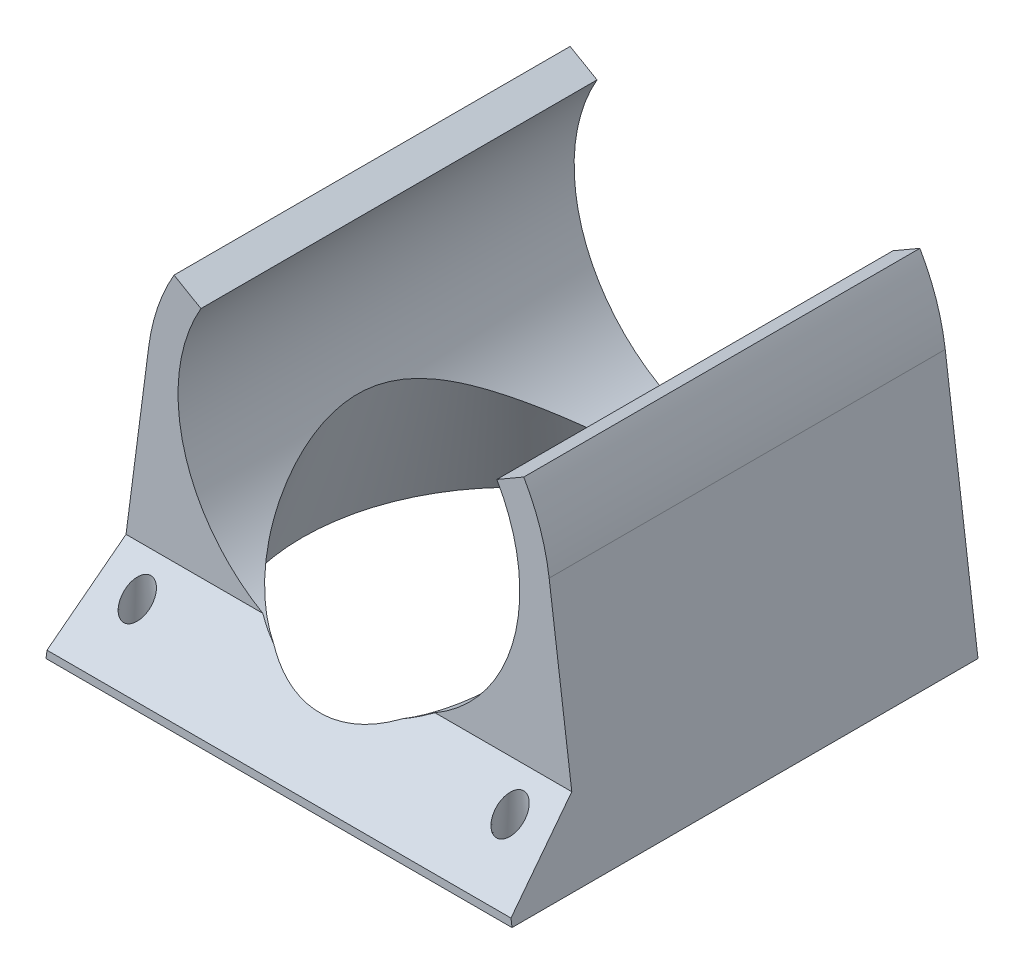
ISO-10303-21;
HEADER;
FILE_DESCRIPTION(('STEP AP214'),'2;1');
FILE_NAME('part.step','',(''),(''),'','','');
FILE_SCHEMA(('AUTOMOTIVE_DESIGN { 1 0 10303 214 1 1 1 1 }'));
ENDSEC;
DATA;
#1=APPLICATION_CONTEXT('core data for automotive mechanical design processes');
#2=APPLICATION_PROTOCOL_DEFINITION('international standard','automotive_design',2000,#1);
#3=PRODUCT_CONTEXT('',#1,'mechanical');
#4=PRODUCT('Part','Part','',(#3));
#5=PRODUCT_RELATED_PRODUCT_CATEGORY('part','',(#4));
#6=PRODUCT_DEFINITION_FORMATION('','',#4);
#7=PRODUCT_DEFINITION_CONTEXT('part definition',#1,'design');
#8=PRODUCT_DEFINITION('design','',#6,#7);
#9=PRODUCT_DEFINITION_SHAPE('','',#8);
#10=(LENGTH_UNIT() NAMED_UNIT(*) SI_UNIT(.MILLI.,.METRE.));
#11=(NAMED_UNIT(*) PLANE_ANGLE_UNIT() SI_UNIT($,.RADIAN.));
#12=(NAMED_UNIT(*) SI_UNIT($,.STERADIAN.) SOLID_ANGLE_UNIT());
#13=UNCERTAINTY_MEASURE_WITH_UNIT(LENGTH_MEASURE(1.E-05),#10,'distance_accuracy_value','');
#14=(GEOMETRIC_REPRESENTATION_CONTEXT(3) GLOBAL_UNCERTAINTY_ASSIGNED_CONTEXT((#13)) GLOBAL_UNIT_ASSIGNED_CONTEXT((#10,
#11,#12)) REPRESENTATION_CONTEXT('',''));
#15=CARTESIAN_POINT('',(0.,0.,0.));
#16=DIRECTION('',(0.,0.,1.));
#17=DIRECTION('',(1.,0.,0.));
#18=AXIS2_PLACEMENT_3D('',#15,#16,#17);
#19=CARTESIAN_POINT('',(0.,0.,30.));
#20=DIRECTION('',(0.,0.,-1.));
#21=DIRECTION('',(-1.,0.,0.));
#22=AXIS2_PLACEMENT_3D('',#19,#20,#21);
#23=CYLINDRICAL_SURFACE('',#22,11.);
#24=CARTESIAN_POINT('',(0.,0.,16.));
#25=DIRECTION('',(0.,-0.707106781186548,-0.707106781186547));
#26=DIRECTION('',(0.,0.707106781186547,-0.707106781186548));
#27=AXIS2_PLACEMENT_3D('',#24,#25,#26);
#28=ELLIPSE('',#27,15.5563491861041,11.);
#29=CARTESIAN_POINT('',(-5.54526825320471,-9.5,25.5));
#30=VERTEX_POINT('',#29);
#31=CARTESIAN_POINT('',(-4.13396076152385,-10.1936435302683,26.1936435302683));
#32=VERTEX_POINT('',#31);
#33=EDGE_CURVE('E140',#30,#32,#28,.F.);
#34=ORIENTED_EDGE('',*,*,#33,.T.);
#35=CARTESIAN_POINT('',(-1.97240147223095,-10.8217204007654,27.0002));
#36=CARTESIAN_POINT('',(-2.09324300865028,-10.7996973938753,26.9722158311186));
#37=CARTESIAN_POINT('',(-2.21313333834511,-10.7757521018031,26.9417612619371));
#38=CARTESIAN_POINT('',(-2.45078188991454,-10.7241989387639,26.8761052678569));
#39=CARTESIAN_POINT('',(-2.56854054902925,-10.6965918287949,26.8409048292186));
#40=CARTESIAN_POINT('',(-2.91788119249448,-10.608653523772,26.7286069704057));
#41=CARTESIAN_POINT('',(-3.14601449121071,-10.5431155108576,26.6446991444481));
#42=CARTESIAN_POINT('',(-3.5889145500775,-10.4006362275708,26.46153530015));
#43=CARTESIAN_POINT('',(-3.80380425443114,-10.3238338097687,26.3624656083746));
#44=CARTESIAN_POINT('',(-4.2223021747069,-10.1598576450405,26.1499038159298));
#45=CARTESIAN_POINT('',(-4.42590418540685,-10.0726782748209,26.0364038931959));
#46=CARTESIAN_POINT('',(-4.86773839025145,-9.86800438913494,25.7683674492329));
#47=CARTESIAN_POINT('',(-5.10285809842134,-9.74820145810219,25.610456703507));
#48=CARTESIAN_POINT('',(-5.55464118830222,-9.49803736862101,25.2777341252788));
#49=CARTESIAN_POINT('',(-5.77130207690748,-9.36767478857727,25.1029200165414));
#50=CARTESIAN_POINT('',(-6.39603616660353,-8.96311944848362,24.5545069507851));
#51=CARTESIAN_POINT('',(-6.77665486099353,-8.67652713380029,24.1583160183444));
#52=CARTESIAN_POINT('',(-7.35324847770205,-8.18669134730268,23.4584206803572));
#53=CARTESIAN_POINT('',(-7.56865735023963,-7.98723056104567,23.1674653122462));
#54=CARTESIAN_POINT('',(-7.9699118526016,-7.58687830728447,22.5663909368067));
#55=CARTESIAN_POINT('',(-8.15574411749837,-7.38598623561416,22.256263353422));
#56=CARTESIAN_POINT('',(-8.49887280000449,-6.98842628549724,21.6183173695006));
#57=CARTESIAN_POINT('',(-8.65617964931898,-6.79175688611521,21.2905054932193));
#58=CARTESIAN_POINT('',(-8.9433607975313,-6.40885583365907,20.6173550209175));
#59=CARTESIAN_POINT('',(-9.07324826121054,-6.22261920323182,20.2720249350941));
#60=CARTESIAN_POINT('',(-9.26706350265499,-5.9280176488123,19.6825665208028));
#61=CARTESIAN_POINT('',(-9.33848631039684,-5.81452129023597,19.4434431687065));
#62=CARTESIAN_POINT('',(-9.46958349518271,-5.59847613357169,18.957111518702));
#63=CARTESIAN_POINT('',(-9.52925835202882,-5.49592688846726,18.7099035514614));
#64=CARTESIAN_POINT('',(-9.6366346624801,-5.30539455727988,18.2081161874823));
#65=CARTESIAN_POINT('',(-9.68436690209421,-5.21737422195536,17.9535576710616));
#66=CARTESIAN_POINT('',(-9.76783477611586,-5.0593883938556,17.4370027589624));
#67=CARTESIAN_POINT('',(-9.8035759587999,-4.98941455442091,17.1750098642112));
#68=CARTESIAN_POINT('',(-9.8570438070747,-4.88277837274259,16.6961701574437));
#69=CARTESIAN_POINT('',(-9.87691953733709,-4.8422880221005,16.4804172574679));
#70=CARTESIAN_POINT('',(-9.9085359334536,-4.77726247832534,16.0459215911155));
#71=CARTESIAN_POINT('',(-9.92027777028878,-4.75272498859921,15.8271792597326));
#72=CARTESIAN_POINT('',(-9.93550152016159,-4.72081863328786,15.3883585645744));
#73=CARTESIAN_POINT('',(-9.93899146547042,-4.71343307238947,15.1682817092348));
#74=CARTESIAN_POINT('',(-9.93769544389486,-4.71616488259127,14.7282552170587));
#75=CARTESIAN_POINT('',(-9.93290922238516,-4.72628279220486,14.5083055843445));
#76=CARTESIAN_POINT('',(-9.91514080086846,-4.76344377565503,14.0708523932004));
#77=CARTESIAN_POINT('',(-9.90218287351062,-4.79043672303719,13.8533435255909));
#78=CARTESIAN_POINT('',(-9.86822125165564,-4.8600099372037,13.4214991856414));
#79=CARTESIAN_POINT('',(-9.84721734971865,-4.90259060586655,13.2071637952672));
#80=CARTESIAN_POINT('',(-9.79727781751881,-5.00164129689129,12.7822709958956));
#81=CARTESIAN_POINT('',(-9.76832732409365,-5.05813732575928,12.5717214620832));
#82=CARTESIAN_POINT('',(-9.70266003378693,-5.18298816486088,12.1553789286314));
#83=CARTESIAN_POINT('',(-9.66594070304548,-5.25134684286835,11.9495875052339));
#84=CARTESIAN_POINT('',(-9.55813876308845,-5.44621192411944,11.4091828637366));
#85=CARTESIAN_POINT('',(-9.48035281765415,-5.58136092118967,11.0790022778722));
#86=CARTESIAN_POINT('',(-9.30394612860968,-5.87071806595257,10.4328211021471));
#87=CARTESIAN_POINT('',(-9.20531164050793,-6.02493875877443,10.1168300342336));
#88=CARTESIAN_POINT('',(-8.98675444256244,-6.34634783538158,9.49796455160237));
#89=CARTESIAN_POINT('',(-8.86677390951003,-6.5135707295169,9.19512861635467));
#90=CARTESIAN_POINT('',(-8.60525051168763,-6.85536201262533,8.60336665958042));
#91=CARTESIAN_POINT('',(-8.46371247916947,-7.02992874909766,8.31443753980552));
#92=CARTESIAN_POINT('',(-8.15002119997034,-7.39172213287893,7.73529062622724));
#93=CARTESIAN_POINT('',(-7.97662399408363,-7.57912196795157,7.44585254765728));
#94=CARTESIAN_POINT('',(-7.60390502451115,-7.95300974490347,6.88337852518298));
#95=CARTESIAN_POINT('',(-7.40457727240488,-8.13949746578396,6.61034639143906));
#96=CARTESIAN_POINT('',(-6.979412778847,-8.50684841005867,6.08316530701621));
#97=CARTESIAN_POINT('',(-6.75365203146665,-8.68772595415242,5.82896549450157));
#98=CARTESIAN_POINT('',(-6.27432122278679,-9.03998999520127,5.34140928812377));
#99=CARTESIAN_POINT('',(-6.0207678594749,-9.21138209892014,5.10804053009998));
#100=CARTESIAN_POINT('',(-5.40867375529439,-9.58690604478201,4.60265387924238));
#101=CARTESIAN_POINT('',(-5.04072725938469,-9.78657855031018,4.33838573176991));
#102=CARTESIAN_POINT('',(-4.45414052664306,-10.0601816180872,3.97990763843225));
#103=CARTESIAN_POINT('',(-4.25286571894958,-10.1470542256549,3.86674939123666));
#104=CARTESIAN_POINT('',(-3.83905258986667,-10.3107281102327,3.65447525401146));
#105=CARTESIAN_POINT('',(-3.62651590456809,-10.3875308445609,3.55535733189022));
#106=CARTESIAN_POINT('',(-3.22565043312596,-10.5181892220528,3.38731384254902));
#107=CARTESIAN_POINT('',(-3.03883703173634,-10.5737520960161,3.31609322867407));
#108=CARTESIAN_POINT('',(-2.658619236562,-10.6756947692541,3.18572699364371));
#109=CARTESIAN_POINT('',(-2.46521620440687,-10.7220764523308,3.12657889536495));
#110=CARTESIAN_POINT('',(-2.0728700861867,-10.8047852058309,3.02128960497652));
#111=CARTESIAN_POINT('',(-1.87392930327058,-10.8411163894703,2.97514309176142));
#112=CARTESIAN_POINT('',(-1.47168097144409,-10.9030067680582,2.89662624947411));
#113=CARTESIAN_POINT('',(-1.26837338985397,-10.9285658823624,2.86425602353708));
#114=CARTESIAN_POINT('',(-0.857930792219364,-10.9684391953933,2.81378997846281));
#115=CARTESIAN_POINT('',(-0.650782458610062,-10.9827010482798,2.79576060606489));
#116=CARTESIAN_POINT('',(-0.235246682641908,-10.9994497191237,2.77458986021733));
#117=CARTESIAN_POINT('',(-0.0268592381642884,-11.0019365169409,2.77144851223222));
#118=CARTESIAN_POINT('',(0.389399300341033,-10.9950761144453,2.78011830372445));
#119=CARTESIAN_POINT('',(0.597270410426065,-10.9857292868789,2.79192897222939));
#120=CARTESIAN_POINT('',(1.01078611094791,-10.9554227846095,2.83026086879755));
#121=CARTESIAN_POINT('',(1.21643076492261,-10.934463442196,2.85678167593345));
#122=CARTESIAN_POINT('',(1.60911975159304,-10.8833385553416,2.92156895528188));
#123=CARTESIAN_POINT('',(1.79643124453702,-10.8539511116982,2.95884385103775));
#124=CARTESIAN_POINT('',(2.16675459838563,-10.7861310965755,3.04502385509959));
#125=CARTESIAN_POINT('',(2.34976482333626,-10.7476951428919,3.09393331231084));
#126=CARTESIAN_POINT('',(2.7104937177453,-10.6624375866691,3.2026728458568));
#127=CARTESIAN_POINT('',(2.88821243411084,-10.6156160584905,3.26250282535189));
#128=CARTESIAN_POINT('',(3.23766626950715,-10.5143060927096,3.39232162098523));
#129=CARTESIAN_POINT('',(3.4094001489154,-10.4598160783928,3.46231252640105));
#130=CARTESIAN_POINT('',(3.81025827310059,-10.3219327606404,3.64000466631679));
#131=CARTESIAN_POINT('',(4.03644414223027,-10.2354157414487,3.75194005941876));
#132=CARTESIAN_POINT('',(4.47548794664397,-10.0512057649688,3.99162954577892));
#133=CARTESIAN_POINT('',(4.688341715229,-9.95350934046847,4.11938854763301));
#134=CARTESIAN_POINT('',(5.10057039894241,-9.74870372614255,4.38905271173864));
#135=CARTESIAN_POINT('',(5.29992540299428,-9.64158114554326,4.53097803834902));
#136=CARTESIAN_POINT('',(5.68473197196954,-9.41982757354151,4.82718197445529));
#137=CARTESIAN_POINT('',(5.87018310182451,-9.30519634739489,4.98146097019974));
#138=CARTESIAN_POINT('',(6.29594089935962,-9.02489259250475,5.36237413617021));
#139=CARTESIAN_POINT('',(6.5299760435784,-8.85651911252494,5.59404850834584));
#140=CARTESIAN_POINT('',(6.97257509289102,-8.51245071413929,6.07560722952808));
#141=CARTESIAN_POINT('',(7.1811285706522,-8.33675283770405,6.32549896690716));
#142=CARTESIAN_POINT('',(7.57419962415557,-7.98134417678862,6.84205842148213));
#143=CARTESIAN_POINT('',(7.758656327261,-7.80162452330059,7.10876619434471));
#144=CARTESIAN_POINT('',(8.10392043041381,-7.44234669882728,7.65705631229453));
#145=CARTESIAN_POINT('',(8.26473117659646,-7.26278850857444,7.93863654510259));
#146=CARTESIAN_POINT('',(8.56867300797722,-6.90183509929716,8.5257670558892));
#147=CARTESIAN_POINT('',(8.71102996054004,-6.72058034871526,8.83180457630401));
#148=CARTESIAN_POINT('',(8.97232947285748,-6.36753636584628,9.45916846909437));
#149=CARTESIAN_POINT('',(9.0912639348805,-6.19575042188795,9.78050008150738));
#150=CARTESIAN_POINT('',(9.3057861546937,-5.86859989259615,10.4376581430807));
#151=CARTESIAN_POINT('',(9.40144535294838,-5.71318591021187,10.7734364180706));
#152=CARTESIAN_POINT('',(9.56987845726402,-5.4263326105318,11.4605578529169));
#153=CARTESIAN_POINT('',(9.64267258587957,-5.29487215148312,11.8118869435634));
#154=CARTESIAN_POINT('',(9.74052628304687,-5.11158033588281,12.3858161393055));
#155=CARTESIAN_POINT('',(9.77303389606861,-5.04892789547487,12.6037137784247));
#156=CARTESIAN_POINT('',(9.82950983087611,-4.93807763362678,13.0442647193575));
#157=CARTESIAN_POINT('',(9.85347958316436,-4.88987739096244,13.2669172178708));
#158=CARTESIAN_POINT('',(9.89264449724148,-4.81015269789127,13.7153671994318));
#159=CARTESIAN_POINT('',(9.90786293463831,-4.77858403192964,13.9411546889151));
#160=CARTESIAN_POINT('',(9.92946857311953,-4.7335281789179,14.3949684058379));
#161=CARTESIAN_POINT('',(9.93585602324009,-4.72004048198003,14.6229945699635));
#162=CARTESIAN_POINT('',(9.93973029969034,-4.71187705077422,15.0803248471726));
#163=CARTESIAN_POINT('',(9.93718350117566,-4.71727238430428,15.3096305382595));
#164=CARTESIAN_POINT('',(9.92314669146168,-4.74672701547799,15.7667482552337));
#165=CARTESIAN_POINT('',(9.91165650286211,-4.77078668334563,15.9945602514017));
#166=CARTESIAN_POINT('',(9.87982260848559,-4.83636453436615,16.4475657194973));
#167=CARTESIAN_POINT('',(9.85945740155754,-4.87792510796165,16.6727514599231));
#168=CARTESIAN_POINT('',(9.81005094530964,-4.97653791119411,17.1187148011484));
#169=CARTESIAN_POINT('',(9.78100828164882,-5.03359266609359,17.3394916770829));
#170=CARTESIAN_POINT('',(9.70026340536229,-5.18800080781528,17.8686575661576));
#171=CARTESIAN_POINT('',(9.64417698048628,-5.2921745274833,18.1743908565526));
#172=CARTESIAN_POINT('',(9.51510076506229,-5.52087667262846,18.7744601235039));
#173=CARTESIAN_POINT('',(9.44210197192198,-5.64541592842436,19.06878993215));
#174=CARTESIAN_POINT('',(9.27915623309082,-5.9094311643933,19.6465393714859));
#175=CARTESIAN_POINT('',(9.18917459412427,-6.04893746357764,19.9299352127445));
#176=CARTESIAN_POINT('',(8.99224195442416,-6.3379948578983,20.4853641103963));
#177=CARTESIAN_POINT('',(8.88529366752747,-6.48754434441168,20.7573989752163));
#178=CARTESIAN_POINT('',(8.64679628855292,-6.80252591562336,21.3070915377736));
#179=CARTESIAN_POINT('',(8.51412349423393,-6.96836548270325,21.5840280583162));
#180=CARTESIAN_POINT('',(8.2285644623675,-7.30336882000701,22.1252335821345));
#181=CARTESIAN_POINT('',(8.0756759384032,-7.47253296439827,22.3895011479269));
#182=CARTESIAN_POINT('',(7.74903643220396,-7.81074150120301,22.9045965215143));
#183=CARTESIAN_POINT('',(7.5752996292588,-7.97978589723175,23.1554332977967));
#184=CARTESIAN_POINT('',(7.20604680143577,-8.31474685774432,23.6427434184859));
#185=CARTESIAN_POINT('',(7.01053534957664,-8.48066407045968,23.879219762749));
#186=CARTESIAN_POINT('',(6.63586753588541,-8.77558537035613,24.2930928888008));
#187=CARTESIAN_POINT('',(6.46057009865195,-8.9056544501998,24.4732263060022));
#188=CARTESIAN_POINT('',(6.09460473707577,-9.15999208808344,24.8218028709854));
#189=CARTESIAN_POINT('',(5.90393226133081,-9.28425891119045,24.9902425294534));
#190=CARTESIAN_POINT('',(5.50771255010775,-9.52463162893557,25.3132771179635));
#191=CARTESIAN_POINT('',(5.30221997174748,-9.64076468132398,25.467918644027));
#192=CARTESIAN_POINT('',(4.87586430668558,-9.86325030215623,25.762118735794));
#193=CARTESIAN_POINT('',(4.65501131745825,-9.96960919105501,25.9016870589504));
#194=CARTESIAN_POINT('',(4.24130660774844,-10.1514678174931,26.1389970719723));
#195=CARTESIAN_POINT('',(4.05102667651153,-10.2290048954794,26.2396633929075));
#196=CARTESIAN_POINT('',(3.66105864936311,-10.3749689914119,26.4284528227026));
#197=CARTESIAN_POINT('',(3.46137472564291,-10.4433999987703,26.5165814255727));
#198=CARTESIAN_POINT('',(3.05141830167729,-10.5704889632709,26.6797612068821));
#199=CARTESIAN_POINT('',(2.84106674273211,-10.6290535208587,26.7546876844115));
#200=CARTESIAN_POINT('',(2.41236679154425,-10.7345004161157,26.8892757905403));
#201=CARTESIAN_POINT('',(2.19400753189124,-10.7813661492993,26.9489157256795));
#202=CARTESIAN_POINT('',(1.97240147223095,-10.8217204007654,27.0002));
#203=B_SPLINE_CURVE_WITH_KNOTS('',3,(#35,#36,#37,#38,#39,#40,#41,#42,#43,#44,#45,#46,#47,#48,
#49,#50,#51,#52,#53,#54,#55,#56,#57,#58,#59,#60,#61,#62,#63,#64,#65,#66,#67,#68,#69,#70,#71,#72,
#73,#74,#75,#76,#77,#78,#79,#80,#81,#82,#83,#84,#85,#86,#87,#88,#89,#90,#91,#92,#93,#94,#95,#96,
#97,#98,#99,#100,#101,#102,#103,#104,#105,#106,#107,#108,#109,#110,#111,#112,#113,#114,#115,
#116,#117,#118,#119,#120,#121,#122,#123,#124,#125,#126,#127,#128,#129,#130,#131,#132,#133,#134,
#135,#136,#137,#138,#139,#140,#141,#142,#143,#144,#145,#146,#147,#148,#149,#150,#151,#152,#153,
#154,#155,#156,#157,#158,#159,#160,#161,#162,#163,#164,#165,#166,#167,#168,#169,#170,#171,#172,
#173,#174,#175,#176,#177,#178,#179,#180,#181,#182,#183,#184,#185,#186,#187,#188,#189,#190,#191,
#192,#193,#194,#195,#196,#197,#198,#199,#200,#201,#202),.UNSPECIFIED.,.F.,.F.,(4,2,2,2,2,2,2,2,
2,2,2,2,2,2,2,2,2,2,2,2,2,2,2,2,2,2,2,2,2,2,2,2,2,2,2,2,2,2,2,2,2,2,2,2,2,2,2,2,2,2,2,2,2,2,2,2,
2,2,2,2,2,2,2,2,2,2,2,2,2,2,2,2,2,2,2,2,2,2,2,2,2,2,2,4),(0.,0.377845782838271,
0.755613164534845,1.50963136346383,2.25503399059267,3.00084240796667,3.92199709389691,
4.84327599726665,6.69416727389581,7.93290435036454,9.17219960149938,10.411040726046,
11.6492856901331,12.471268660231,13.2932180524732,14.1130262490306,14.9324545945067,
15.5930315612594,16.2535134094868,16.9133520891486,17.5732110698293,18.2311192253414,
18.8890443440618,19.5482085193663,20.2075880179568,21.3012896453928,22.3957145618091,
23.4931505459111,24.5903408937534,25.7470278731574,26.9039824545441,28.0576889290288,
29.2107060094717,30.6899921229694,31.4294191675485,32.1687390834028,32.79065554256,
33.4124442639705,34.0339781375742,34.6555166641647,35.2799185124176,35.9043214286488,
36.5287046773506,37.1530700603875,37.7321442966069,38.3114353271772,38.8907212210344,
39.4701263961209,40.2692955605774,41.0687132568328,41.8692855268246,42.6698828372088,
43.7778196082418,44.8862082494735,45.9973448506467,47.108324063437,48.2565754983739,
49.4052232178718,50.550299529059,51.6943602300416,52.380936336896,53.0673973550461,
53.7520240670894,54.4366314720858,55.1238182181356,55.811018595506,56.4998931622773,
57.1888800702038,58.1707763115861,59.1531964301842,60.1376456372474,61.1219375388778,
62.1680922279791,63.2143653394682,64.2599308524369,65.3052771928072,66.1536687815166,
67.0023124442464,67.8479722590765,68.6930813230329,69.3788471947025,70.0643116329952,
70.7559389717015,71.448542446199),.UNSPECIFIED.);
#204=CARTESIAN_POINT('',(4.13396076152385,-10.1936435302683,26.1936435302683));
#205=VERTEX_POINT('',#204);
#206=EDGE_CURVE('E60',#32,#205,#203,.T.);
#207=ORIENTED_EDGE('',*,*,#206,.T.);
#208=CARTESIAN_POINT('',(5.54526825320471,-9.5,25.5));
#209=VERTEX_POINT('',#208);
#210=EDGE_CURVE('E137',#205,#209,#28,.F.);
#211=ORIENTED_EDGE('',*,*,#210,.T.);
#212=CARTESIAN_POINT('',(0.,0.,25.5));
#213=DIRECTION('',(0.,0.,-1.));
#214=DIRECTION('',(-1.,0.,0.));
#215=AXIS2_PLACEMENT_3D('',#212,#213,#214);
#216=CIRCLE('',#215,11.);
#217=CARTESIAN_POINT('',(9.5262794416288,5.50000000000005,25.5));
#218=VERTEX_POINT('',#217);
#219=EDGE_CURVE('E158',#209,#218,#216,.F.);
#220=ORIENTED_EDGE('',*,*,#219,.T.);
#221=DIRECTION('',(0.,0.,-1.));
#222=VECTOR('',#221,1.);
#223=CARTESIAN_POINT('',(9.5262794416288,5.50000000000005,30.));
#224=LINE('',#223,#222);
#225=CARTESIAN_POINT('',(9.5262794416288,5.50000000000005,0.));
#226=VERTEX_POINT('',#225);
#227=EDGE_CURVE('E178',#218,#226,#224,.T.);
#228=ORIENTED_EDGE('',*,*,#227,.T.);
#229=CARTESIAN_POINT('',(0.,0.,0.));
#230=DIRECTION('',(0.,0.,-1.));
#231=DIRECTION('',(1.,0.,0.));
#232=AXIS2_PLACEMENT_3D('',#229,#230,#231);
#233=CIRCLE('',#232,11.);
#234=CARTESIAN_POINT('',(-9.52627944162884,5.49999999999997,0.));
#235=VERTEX_POINT('',#234);
#236=EDGE_CURVE('E179',#226,#235,#233,.T.);
#237=ORIENTED_EDGE('',*,*,#236,.T.);
#238=DIRECTION('',(0.,0.,-1.));
#239=VECTOR('',#238,1.);
#240=CARTESIAN_POINT('',(-9.52627944162884,5.49999999999997,30.));
#241=LINE('',#240,#239);
#242=CARTESIAN_POINT('',(-9.52627944162884,5.49999999999997,25.5));
#243=VERTEX_POINT('',#242);
#244=EDGE_CURVE('E215',#243,#235,#241,.T.);
#245=ORIENTED_EDGE('',*,*,#244,.F.);
#246=EDGE_CURVE('E161',#243,#30,#216,.F.);
#247=ORIENTED_EDGE('',*,*,#246,.T.);
#248=EDGE_LOOP('',(#34,#207,#211,#220,#228,#237,#245,#247));
#249=FACE_BOUND('',#248,.T.);
#250=ADVANCED_FACE('F44',(#249),#23,.F.);
#251=CARTESIAN_POINT('',(-9.52627944162884,5.49999999999997,30.));
#252=DIRECTION('',(-0.499999999999997,-0.86602540378444,0.));
#253=DIRECTION('',(0.86602540378444,-0.499999999999997,0.));
#254=AXIS2_PLACEMENT_3D('',#251,#252,#253);
#255=PLANE('',#254);
#256=DIRECTION('',(0.,0.,-1.));
#257=VECTOR('',#256,1.);
#258=CARTESIAN_POINT('',(-11.2583302491977,6.49999999999997,30.));
#259=LINE('',#258,#257);
#260=CARTESIAN_POINT('',(-11.2583302491977,6.49999999999997,25.5));
#261=VERTEX_POINT('',#260);
#262=CARTESIAN_POINT('',(-11.2583302491977,6.49999999999997,0.));
#263=VERTEX_POINT('',#262);
#264=EDGE_CURVE('E213',#261,#263,#259,.T.);
#265=ORIENTED_EDGE('',*,*,#264,.F.);
#266=DIRECTION('',(0.86602540378444,-0.499999999999997,0.));
#267=VECTOR('',#266,1.);
#268=CARTESIAN_POINT('',(-9.52627944162884,5.49999999999997,25.5));
#269=LINE('',#268,#267);
#270=EDGE_CURVE('E167',#261,#243,#269,.T.);
#271=ORIENTED_EDGE('',*,*,#270,.T.);
#272=ORIENTED_EDGE('',*,*,#244,.T.);
#273=DIRECTION('',(-0.86602540378444,0.499999999999997,0.));
#274=VECTOR('',#273,1.);
#275=CARTESIAN_POINT('',(-9.52627944162884,5.49999999999997,0.));
#276=LINE('',#275,#274);
#277=EDGE_CURVE('E182',#235,#263,#276,.T.);
#278=ORIENTED_EDGE('',*,*,#277,.T.);
#279=EDGE_LOOP('',(#265,#271,#272,#278));
#280=FACE_BOUND('',#279,.T.);
#281=ADVANCED_FACE('F285',(#280),#255,.F.);
#282=CARTESIAN_POINT('',(0.,0.,30.));
#283=DIRECTION('',(0.,0.,-1.));
#284=DIRECTION('',(-1.,0.,0.));
#285=AXIS2_PLACEMENT_3D('',#282,#283,#284);
#286=CYLINDRICAL_SURFACE('',#285,13.);
#287=DIRECTION('',(0.,0.,-1.));
#288=VECTOR('',#287,1.);
#289=CARTESIAN_POINT('',(-12.8909507923888,1.68029392316081,30.));
#290=LINE('',#289,#288);
#291=CARTESIAN_POINT('',(-12.8909507923888,1.68029392316081,25.5));
#292=VERTEX_POINT('',#291);
#293=CARTESIAN_POINT('',(-12.8909507923888,1.68029392316081,0.));
#294=VERTEX_POINT('',#293);
#295=EDGE_CURVE('E211',#292,#294,#290,.T.);
#296=ORIENTED_EDGE('',*,*,#295,.F.);
#297=CARTESIAN_POINT('',(0.,0.,25.5));
#298=DIRECTION('',(0.,0.,-1.));
#299=DIRECTION('',(-1.,0.,0.));
#300=AXIS2_PLACEMENT_3D('',#297,#298,#299);
#301=CIRCLE('',#300,13.);
#302=EDGE_CURVE('E164',#292,#261,#301,.T.);
#303=ORIENTED_EDGE('',*,*,#302,.T.);
#304=ORIENTED_EDGE('',*,*,#264,.T.);
#305=CARTESIAN_POINT('',(0.,0.,0.));
#306=DIRECTION('',(0.,0.,1.));
#307=DIRECTION('',(1.,0.,0.));
#308=AXIS2_PLACEMENT_3D('',#305,#306,#307);
#309=CIRCLE('',#308,13.);
#310=EDGE_CURVE('E185',#263,#294,#309,.T.);
#311=ORIENTED_EDGE('',*,*,#310,.T.);
#312=EDGE_LOOP('',(#296,#303,#304,#311));
#313=FACE_BOUND('',#312,.T.);
#314=ADVANCED_FACE('F282',(#313),#286,.T.);
#315=CARTESIAN_POINT('',(-12.8909507923888,1.68029392316081,30.));
#316=DIRECTION('',(0.991611599414521,-0.129253378704677,0.));
#317=DIRECTION('',(0.129253378704677,0.991611599414521,0.));
#318=AXIS2_PLACEMENT_3D('',#315,#316,#317);
#319=PLANE('',#318);
#320=DIRECTION('',(0.0917800739236211,0.704122296916727,-0.704122296916727));
#321=VECTOR('',#320,1.);
#322=CARTESIAN_POINT('',(-13.9042803235243,-6.09381091783639,22.0938109178364));
#323=LINE('',#322,#321);
#324=CARTESIAN_POINT('',(-14.9348266101461,-14.,30.));
#325=VERTEX_POINT('',#324);
#326=CARTESIAN_POINT('',(-14.3482661014605,-9.5,25.5));
#327=VERTEX_POINT('',#326);
#328=EDGE_CURVE('E67',#325,#327,#323,.T.);
#329=ORIENTED_EDGE('',*,*,#328,.T.);
#330=DIRECTION('',(0.129253378704677,0.991611599414521,0.));
#331=VECTOR('',#330,1.);
#332=CARTESIAN_POINT('',(-12.8909507923888,1.68029392316081,25.5));
#333=LINE('',#332,#331);
#334=EDGE_CURVE('E160',#327,#292,#333,.T.);
#335=ORIENTED_EDGE('',*,*,#334,.T.);
#336=ORIENTED_EDGE('',*,*,#295,.T.);
#337=DIRECTION('',(-0.129253378704677,-0.991611599414522,0.));
#338=VECTOR('',#337,1.);
#339=CARTESIAN_POINT('',(-12.8909507923888,1.68029392316081,0.));
#340=LINE('',#339,#338);
#341=CARTESIAN_POINT('',(-15.,-14.5,0.));
#342=VERTEX_POINT('',#341);
#343=EDGE_CURVE('E188',#294,#342,#340,.T.);
#344=ORIENTED_EDGE('',*,*,#343,.T.);
#345=DIRECTION('',(0.,0.,-1.));
#346=VECTOR('',#345,1.);
#347=CARTESIAN_POINT('',(-15.,-14.5,30.));
#348=LINE('',#347,#346);
#349=CARTESIAN_POINT('',(-15.,-14.5,30.));
#350=VERTEX_POINT('',#349);
#351=EDGE_CURVE('E208',#350,#342,#348,.T.);
#352=ORIENTED_EDGE('',*,*,#351,.F.);
#353=DIRECTION('',(-0.129253378704677,-0.991611599414522,0.));
#354=VECTOR('',#353,1.);
#355=CARTESIAN_POINT('',(-12.8909507923888,1.68029392316081,30.));
#356=LINE('',#355,#354);
#357=EDGE_CURVE('E170',#325,#350,#356,.T.);
#358=ORIENTED_EDGE('',*,*,#357,.F.);
#359=EDGE_LOOP('',(#329,#335,#336,#344,#352,#358));
#360=FACE_BOUND('',#359,.T.);
#361=ADVANCED_FACE('F278',(#360),#319,.F.);
#362=CARTESIAN_POINT('',(-15.,-14.5,30.));
#363=DIRECTION('',(0.,1.,0.));
#364=DIRECTION('',(0.,0.,1.));
#365=AXIS2_PLACEMENT_3D('',#362,#363,#364);
#366=PLANE('',#365);
#367=CARTESIAN_POINT('',(12.,-14.5,3.));
#368=DIRECTION('',(0.,-1.,0.));
#369=DIRECTION('',(0.,0.,-1.));
#370=AXIS2_PLACEMENT_3D('',#367,#368,#369);
#371=CIRCLE('',#370,1.35);
#372=CARTESIAN_POINT('',(12.,-14.5,1.65));
#373=VERTEX_POINT('',#372);
#374=EDGE_CURVE('E459',#373,#373,#371,.T.);
#375=ORIENTED_EDGE('',*,*,#374,.F.);
#376=EDGE_LOOP('',(#375));
#377=FACE_BOUND('',#376,.T.);
#378=CARTESIAN_POINT('',(-12.,-14.5,2.99999999999999));
#379=DIRECTION('',(0.,-1.,0.));
#380=DIRECTION('',(0.,0.,-1.));
#381=AXIS2_PLACEMENT_3D('',#378,#379,#380);
#382=CIRCLE('',#381,1.35);
#383=CARTESIAN_POINT('',(-12.,-14.5,1.64999999999999));
#384=VERTEX_POINT('',#383);
#385=EDGE_CURVE('E458',#384,#384,#382,.T.);
#386=ORIENTED_EDGE('',*,*,#385,.F.);
#387=EDGE_LOOP('',(#386));
#388=FACE_BOUND('',#387,.T.);
#389=CARTESIAN_POINT('',(12.,-14.5,27.));
#390=DIRECTION('',(0.,-1.,0.));
#391=DIRECTION('',(0.,0.,-1.));
#392=AXIS2_PLACEMENT_3D('',#389,#390,#391);
#393=CIRCLE('',#392,1.35);
#394=CARTESIAN_POINT('',(12.,-14.5,25.65));
#395=VERTEX_POINT('',#394);
#396=EDGE_CURVE('E232',#395,#395,#393,.T.);
#397=ORIENTED_EDGE('',*,*,#396,.F.);
#398=EDGE_LOOP('',(#397));
#399=FACE_BOUND('',#398,.T.);
#400=CARTESIAN_POINT('',(-12.,-14.5,27.));
#401=DIRECTION('',(0.,-1.,0.));
#402=DIRECTION('',(0.,0.,-1.));
#403=AXIS2_PLACEMENT_3D('',#400,#401,#402);
#404=CIRCLE('',#403,1.35);
#405=CARTESIAN_POINT('',(-12.,-14.5,25.65));
#406=VERTEX_POINT('',#405);
#407=EDGE_CURVE('E222',#406,#406,#404,.T.);
#408=ORIENTED_EDGE('',*,*,#407,.F.);
#409=EDGE_LOOP('',(#408));
#410=FACE_BOUND('',#409,.T.);
#411=CARTESIAN_POINT('',(0.,-14.5,15.));
#412=DIRECTION('',(0.,-1.,0.));
#413=DIRECTION('',(0.,0.,-1.));
#414=AXIS2_PLACEMENT_3D('',#411,#412,#413);
#415=CIRCLE('',#414,13.5);
#416=CARTESIAN_POINT('',(0.,-14.5,1.5));
#417=VERTEX_POINT('',#416);
#418=EDGE_CURVE('E142',#417,#417,#415,.T.);
#419=ORIENTED_EDGE('',*,*,#418,.F.);
#420=EDGE_LOOP('',(#419));
#421=FACE_BOUND('',#420,.T.);
#422=DIRECTION('',(1.,0.,0.));
#423=VECTOR('',#422,1.);
#424=CARTESIAN_POINT('',(-15.,-14.5,0.));
#425=LINE('',#424,#423);
#426=CARTESIAN_POINT('',(15.,-14.5,0.));
#427=VERTEX_POINT('',#426);
#428=EDGE_CURVE('E190',#342,#427,#425,.T.);
#429=ORIENTED_EDGE('',*,*,#428,.T.);
#430=DIRECTION('',(0.,0.,-1.));
#431=VECTOR('',#430,1.);
#432=CARTESIAN_POINT('',(15.,-14.5,30.));
#433=LINE('',#432,#431);
#434=CARTESIAN_POINT('',(15.,-14.5,30.));
#435=VERTEX_POINT('',#434);
#436=EDGE_CURVE('E205',#435,#427,#433,.T.);
#437=ORIENTED_EDGE('',*,*,#436,.F.);
#438=DIRECTION('',(1.,0.,0.));
#439=VECTOR('',#438,1.);
#440=CARTESIAN_POINT('',(-15.,-14.5,30.));
#441=LINE('',#440,#439);
#442=EDGE_CURVE('E172',#350,#435,#441,.T.);
#443=ORIENTED_EDGE('',*,*,#442,.F.);
#444=ORIENTED_EDGE('',*,*,#351,.T.);
#445=EDGE_LOOP('',(#429,#437,#443,#444));
#446=FACE_BOUND('',#445,.T.);
#447=ADVANCED_FACE('F274',(#377,#388,#399,#410,#421,#446),#366,.F.);
#448=CARTESIAN_POINT('',(15.,-14.5,30.));
#449=DIRECTION('',(-0.991611599414521,-0.129253378704677,0.));
#450=DIRECTION('',(0.129253378704677,-0.991611599414521,0.));
#451=AXIS2_PLACEMENT_3D('',#448,#449,#450);
#452=PLANE('',#451);
#453=DIRECTION('',(0.,0.,-1.));
#454=VECTOR('',#453,1.);
#455=CARTESIAN_POINT('',(12.8909507923888,1.68029392316081,30.));
#456=LINE('',#455,#454);
#457=CARTESIAN_POINT('',(12.8909507923888,1.68029392316081,25.5));
#458=VERTEX_POINT('',#457);
#459=CARTESIAN_POINT('',(12.8909507923888,1.68029392316081,0.));
#460=VERTEX_POINT('',#459);
#461=EDGE_CURVE('E203',#458,#460,#456,.T.);
#462=ORIENTED_EDGE('',*,*,#461,.F.);
#463=DIRECTION('',(0.129253378704677,-0.991611599414521,0.));
#464=VECTOR('',#463,1.);
#465=CARTESIAN_POINT('',(15.,-14.5,25.5));
#466=LINE('',#465,#464);
#467=CARTESIAN_POINT('',(14.3482661014605,-9.5,25.5));
#468=VERTEX_POINT('',#467);
#469=EDGE_CURVE('E155',#458,#468,#466,.T.);
#470=ORIENTED_EDGE('',*,*,#469,.T.);
#471=DIRECTION('',(0.0917800739236211,-0.704122296916727,0.704122296916727));
#472=VECTOR('',#471,1.);
#473=CARTESIAN_POINT('',(14.9676878017689,-14.2521058954924,30.2521058954924));
#474=LINE('',#473,#472);
#475=CARTESIAN_POINT('',(14.9348266101461,-14.,30.));
#476=VERTEX_POINT('',#475);
#477=EDGE_CURVE('E149',#468,#476,#474,.T.);
#478=ORIENTED_EDGE('',*,*,#477,.T.);
#479=DIRECTION('',(-0.129253378704677,0.991611599414522,0.));
#480=VECTOR('',#479,1.);
#481=CARTESIAN_POINT('',(15.,-14.5,30.));
#482=LINE('',#481,#480);
#483=EDGE_CURVE('E175',#435,#476,#482,.T.);
#484=ORIENTED_EDGE('',*,*,#483,.F.);
#485=ORIENTED_EDGE('',*,*,#436,.T.);
#486=DIRECTION('',(-0.129253378704677,0.991611599414522,0.));
#487=VECTOR('',#486,1.);
#488=CARTESIAN_POINT('',(15.,-14.5,0.));
#489=LINE('',#488,#487);
#490=EDGE_CURVE('E192',#427,#460,#489,.T.);
#491=ORIENTED_EDGE('',*,*,#490,.T.);
#492=EDGE_LOOP('',(#462,#470,#478,#484,#485,#491));
#493=FACE_BOUND('',#492,.T.);
#494=ADVANCED_FACE('F270',(#493),#452,.F.);
#495=CARTESIAN_POINT('',(0.,0.,30.));
#496=DIRECTION('',(0.,0.,-1.));
#497=DIRECTION('',(-1.,0.,0.));
#498=AXIS2_PLACEMENT_3D('',#495,#496,#497);
#499=CYLINDRICAL_SURFACE('',#498,13.);
#500=DIRECTION('',(0.,0.,-1.));
#501=VECTOR('',#500,1.);
#502=CARTESIAN_POINT('',(11.2583302491977,6.50000000000006,30.));
#503=LINE('',#502,#501);
#504=CARTESIAN_POINT('',(11.2583302491977,6.50000000000006,25.5));
#505=VERTEX_POINT('',#504);
#506=CARTESIAN_POINT('',(11.2583302491977,6.50000000000006,0.));
#507=VERTEX_POINT('',#506);
#508=EDGE_CURVE('E201',#505,#507,#503,.T.);
#509=ORIENTED_EDGE('',*,*,#508,.F.);
#510=CARTESIAN_POINT('',(0.,0.,25.5));
#511=DIRECTION('',(0.,0.,-1.));
#512=DIRECTION('',(-1.,0.,0.));
#513=AXIS2_PLACEMENT_3D('',#510,#511,#512);
#514=CIRCLE('',#513,13.);
#515=EDGE_CURVE('E148',#505,#458,#514,.T.);
#516=ORIENTED_EDGE('',*,*,#515,.T.);
#517=ORIENTED_EDGE('',*,*,#461,.T.);
#518=CARTESIAN_POINT('',(0.,0.,0.));
#519=DIRECTION('',(0.,0.,1.));
#520=DIRECTION('',(1.,0.,0.));
#521=AXIS2_PLACEMENT_3D('',#518,#519,#520);
#522=CIRCLE('',#521,13.);
#523=EDGE_CURVE('E195',#460,#507,#522,.T.);
#524=ORIENTED_EDGE('',*,*,#523,.T.);
#525=EDGE_LOOP('',(#509,#516,#517,#524));
#526=FACE_BOUND('',#525,.T.);
#527=ADVANCED_FACE('F266',(#526),#499,.T.);
#528=CARTESIAN_POINT('',(11.2583302491977,6.50000000000006,30.));
#529=DIRECTION('',(0.500000000000004,-0.866025403784436,0.));
#530=DIRECTION('',(0.866025403784437,0.500000000000004,0.));
#531=AXIS2_PLACEMENT_3D('',#528,#529,#530);
#532=PLANE('',#531);
#533=ORIENTED_EDGE('',*,*,#227,.F.);
#534=DIRECTION('',(0.866025403784437,0.500000000000004,0.));
#535=VECTOR('',#534,1.);
#536=CARTESIAN_POINT('',(11.2583302491977,6.50000000000006,25.5));
#537=LINE('',#536,#535);
#538=EDGE_CURVE('E53',#218,#505,#537,.T.);
#539=ORIENTED_EDGE('',*,*,#538,.T.);
#540=ORIENTED_EDGE('',*,*,#508,.T.);
#541=DIRECTION('',(-0.866025403784437,-0.500000000000004,0.));
#542=VECTOR('',#541,1.);
#543=CARTESIAN_POINT('',(11.2583302491977,6.50000000000006,0.));
#544=LINE('',#543,#542);
#545=EDGE_CURVE('E173',#507,#226,#544,.T.);
#546=ORIENTED_EDGE('',*,*,#545,.T.);
#547=EDGE_LOOP('',(#533,#539,#540,#546));
#548=FACE_BOUND('',#547,.T.);
#549=ADVANCED_FACE('F259',(#548),#532,.F.);
#550=CARTESIAN_POINT('',(0.,0.,30.));
#551=DIRECTION('',(0.,0.,1.));
#552=DIRECTION('',(1.,0.,0.));
#553=AXIS2_PLACEMENT_3D('',#550,#551,#552);
#554=PLANE('',#553);
#555=DIRECTION('',(1.,0.,0.));
#556=VECTOR('',#555,1.);
#557=CARTESIAN_POINT('',(0.,-14.,30.));
#558=LINE('',#557,#556);
#559=EDGE_CURVE('E217',#325,#476,#558,.T.);
#560=ORIENTED_EDGE('',*,*,#559,.F.);
#561=ORIENTED_EDGE('',*,*,#357,.T.);
#562=ORIENTED_EDGE('',*,*,#442,.T.);
#563=ORIENTED_EDGE('',*,*,#483,.T.);
#564=EDGE_LOOP('',(#560,#561,#562,#563));
#565=FACE_BOUND('',#564,.T.);
#566=ADVANCED_FACE('F256',(#565),#554,.T.);
#567=CARTESIAN_POINT('',(0.,0.,0.));
#568=DIRECTION('',(0.,0.,1.));
#569=DIRECTION('',(1.,0.,0.));
#570=AXIS2_PLACEMENT_3D('',#567,#568,#569);
#571=PLANE('',#570);
#572=ORIENTED_EDGE('',*,*,#236,.F.);
#573=ORIENTED_EDGE('',*,*,#545,.F.);
#574=ORIENTED_EDGE('',*,*,#523,.F.);
#575=ORIENTED_EDGE('',*,*,#490,.F.);
#576=ORIENTED_EDGE('',*,*,#428,.F.);
#577=ORIENTED_EDGE('',*,*,#343,.F.);
#578=ORIENTED_EDGE('',*,*,#310,.F.);
#579=ORIENTED_EDGE('',*,*,#277,.F.);
#580=EDGE_LOOP('',(#572,#573,#574,#575,#576,#577,#578,#579));
#581=FACE_BOUND('',#580,.T.);
#582=ADVANCED_FACE('F251',(#581),#571,.F.);
#583=CARTESIAN_POINT('',(-25.,-9.5,25.5));
#584=DIRECTION('',(0.,0.,-1.));
#585=DIRECTION('',(-1.,0.,0.));
#586=AXIS2_PLACEMENT_3D('',#583,#584,#585);
#587=PLANE('',#586);
#588=ORIENTED_EDGE('',*,*,#270,.F.);
#589=ORIENTED_EDGE('',*,*,#302,.F.);
#590=ORIENTED_EDGE('',*,*,#334,.F.);
#591=DIRECTION('',(1.,0.,0.));
#592=VECTOR('',#591,1.);
#593=CARTESIAN_POINT('',(-25.,-9.5,25.5));
#594=LINE('',#593,#592);
#595=EDGE_CURVE('E306',#327,#30,#594,.T.);
#596=ORIENTED_EDGE('',*,*,#595,.T.);
#597=ORIENTED_EDGE('',*,*,#246,.F.);
#598=EDGE_LOOP('',(#588,#589,#590,#596,#597));
#599=FACE_BOUND('',#598,.T.);
#600=ADVANCED_FACE('F247',(#599),#587,.F.);
#601=EDGE_CURVE('E141',#209,#468,#594,.T.);
#602=ORIENTED_EDGE('',*,*,#601,.T.);
#603=ORIENTED_EDGE('',*,*,#469,.F.);
#604=ORIENTED_EDGE('',*,*,#515,.F.);
#605=ORIENTED_EDGE('',*,*,#538,.F.);
#606=ORIENTED_EDGE('',*,*,#219,.F.);
#607=EDGE_LOOP('',(#602,#603,#604,#605,#606));
#608=FACE_BOUND('',#607,.T.);
#609=ADVANCED_FACE('F250',(#608),#587,.F.);
#610=CARTESIAN_POINT('',(-25.,-14.,30.));
#611=DIRECTION('',(0.,-0.707106781186548,-0.707106781186547));
#612=DIRECTION('',(0.,0.707106781186547,-0.707106781186548));
#613=AXIS2_PLACEMENT_3D('',#610,#611,#612);
#614=PLANE('',#613);
#615=CARTESIAN_POINT('',(12.,-11.1230291226294,27.1230291226294));
#616=DIRECTION('',(0.,-0.707106781186548,-0.707106781186547));
#617=DIRECTION('',(0.,-0.707106781186547,0.707106781186548));
#618=AXIS2_PLACEMENT_3D('',#615,#616,#617);
#619=ELLIPSE('',#618,1.23799929150689,0.866709269519387);
#620=CARTESIAN_POINT('',(12.,-11.9984268167581,27.9984268167581));
#621=VERTEX_POINT('',#620);
#622=EDGE_CURVE('E48',#621,#621,#619,.T.);
#623=ORIENTED_EDGE('',*,*,#622,.T.);
#624=EDGE_LOOP('',(#623));
#625=FACE_BOUND('',#624,.T.);
#626=CARTESIAN_POINT('',(-12.,-11.1230291226294,27.1230291226294));
#627=DIRECTION('',(0.,-0.707106781186548,-0.707106781186547));
#628=DIRECTION('',(0.,-0.707106781186547,0.707106781186548));
#629=AXIS2_PLACEMENT_3D('',#626,#627,#628);
#630=ELLIPSE('',#629,1.23799929150689,0.866709269519387);
#631=CARTESIAN_POINT('',(-12.,-11.9984268167581,27.9984268167581));
#632=VERTEX_POINT('',#631);
#633=EDGE_CURVE('E220',#632,#632,#630,.T.);
#634=ORIENTED_EDGE('',*,*,#633,.T.);
#635=EDGE_LOOP('',(#634));
#636=FACE_BOUND('',#635,.T.);
#637=ORIENTED_EDGE('',*,*,#210,.F.);
#638=CARTESIAN_POINT('',(0.,-2.2970160181215,18.2970160181215));
#639=DIRECTION('',(0.,-0.707106781186548,-0.707106781186547));
#640=DIRECTION('',(0.,-0.707106781186547,0.707106781186548));
#641=AXIS2_PLACEMENT_3D('',#638,#639,#640);
#642=ELLIPSE('',#641,12.8106211146336,8.43716137380327);
#643=EDGE_CURVE('E13',#205,#32,#642,.T.);
#644=ORIENTED_EDGE('',*,*,#643,.T.);
#645=ORIENTED_EDGE('',*,*,#33,.F.);
#646=ORIENTED_EDGE('',*,*,#595,.F.);
#647=ORIENTED_EDGE('',*,*,#328,.F.);
#648=ORIENTED_EDGE('',*,*,#559,.T.);
#649=ORIENTED_EDGE('',*,*,#477,.F.);
#650=ORIENTED_EDGE('',*,*,#601,.F.);
#651=EDGE_LOOP('',(#637,#644,#645,#646,#647,#648,#649,#650));
#652=FACE_BOUND('',#651,.T.);
#653=ADVANCED_FACE('F145',(#625,#636,#652),#614,.F.);
#654=CARTESIAN_POINT('',(0.,-14.5,15.));
#655=DIRECTION('',(0.,-1.,0.));
#656=DIRECTION('',(0.,0.,-1.));
#657=AXIS2_PLACEMENT_3D('',#654,#655,#656);
#658=CONICAL_SURFACE('',#657,13.5,0.349065850398867);
#659=ORIENTED_EDGE('',*,*,#418,.T.);
#660=EDGE_LOOP('',(#659));
#661=FACE_BOUND('',#660,.T.);
#662=ORIENTED_EDGE('',*,*,#643,.F.);
#663=ORIENTED_EDGE('',*,*,#206,.F.);
#664=EDGE_LOOP('',(#662,#663));
#665=FACE_BOUND('',#664,.T.);
#666=ADVANCED_FACE('F132',(#661,#665),#658,.F.);
#667=CARTESIAN_POINT('',(-12.,-14.5,27.));
#668=DIRECTION('',(0.,-1.,0.));
#669=DIRECTION('',(0.,0.,-1.));
#670=AXIS2_PLACEMENT_3D('',#667,#668,#669);
#671=CONICAL_SURFACE('',#670,1.35,0.139626340159547);
#672=ORIENTED_EDGE('',*,*,#407,.T.);
#673=EDGE_LOOP('',(#672));
#674=FACE_BOUND('',#673,.T.);
#675=ORIENTED_EDGE('',*,*,#633,.F.);
#676=EDGE_LOOP('',(#675));
#677=FACE_BOUND('',#676,.T.);
#678=ADVANCED_FACE('F244',(#674,#677),#671,.F.);
#679=CARTESIAN_POINT('',(12.,-14.5,27.));
#680=DIRECTION('',(0.,-1.,0.));
#681=DIRECTION('',(0.,0.,-1.));
#682=AXIS2_PLACEMENT_3D('',#679,#680,#681);
#683=CONICAL_SURFACE('',#682,1.35,0.139626340159547);
#684=ORIENTED_EDGE('',*,*,#396,.T.);
#685=EDGE_LOOP('',(#684));
#686=FACE_BOUND('',#685,.T.);
#687=ORIENTED_EDGE('',*,*,#622,.F.);
#688=EDGE_LOOP('',(#687));
#689=FACE_BOUND('',#688,.T.);
#690=ADVANCED_FACE('F337',(#686,#689),#683,.F.);
#691=CARTESIAN_POINT('',(-12.,-14.5,2.99999999999999));
#692=DIRECTION('',(0.,-1.,0.));
#693=DIRECTION('',(0.,0.,-1.));
#694=AXIS2_PLACEMENT_3D('',#691,#692,#693);
#695=CONICAL_SURFACE('',#694,1.35,0.139626340159547);
#696=CARTESIAN_POINT('',(-12.,-6.5,2.99999999999999));
#697=DIRECTION('',(0.,-1.,0.));
#698=DIRECTION('',(0.,0.,-1.));
#699=AXIS2_PLACEMENT_3D('',#696,#697,#698);
#700=CIRCLE('',#699,0.225673322380866);
#701=CARTESIAN_POINT('',(-12.,-6.5,2.77432667761913));
#702=VERTEX_POINT('',#701);
#703=EDGE_CURVE('E462',#702,#702,#700,.T.);
#704=CARTESIAN_POINT('',(-12.,-6.5,2.77432667761913));
#705=CARTESIAN_POINT('',(-12.,-6.58333333333333,2.76261494139393));
#706=CARTESIAN_POINT('',(-12.,-6.66666666666667,2.75090320516873));
#707=CARTESIAN_POINT('',(-12.,-6.83333333333333,2.72747973271833));
#708=CARTESIAN_POINT('',(-12.,-6.91666666666667,2.71576799649313));
#709=CARTESIAN_POINT('',(-12.,-7.08333333333333,2.69234452404273));
#710=CARTESIAN_POINT('',(-12.,-7.16666666666667,2.68063278781753));
#711=CARTESIAN_POINT('',(-12.,-7.33333333333333,2.65720931536713));
#712=CARTESIAN_POINT('',(-12.,-7.41666666666667,2.64549757914194));
#713=CARTESIAN_POINT('',(-12.,-7.58333333333333,2.62207410669154));
#714=CARTESIAN_POINT('',(-12.,-7.66666666666667,2.61036237046634));
#715=CARTESIAN_POINT('',(-12.,-7.83333333333333,2.58693889801594));
#716=CARTESIAN_POINT('',(-12.,-7.91666666666667,2.57522716179074));
#717=CARTESIAN_POINT('',(-12.,-8.08333333333333,2.55180368934034));
#718=CARTESIAN_POINT('',(-12.,-8.16666666666667,2.54009195311514));
#719=CARTESIAN_POINT('',(-12.,-8.33333333333333,2.51666848066474));
#720=CARTESIAN_POINT('',(-12.,-8.41666666666667,2.50495674443954));
#721=CARTESIAN_POINT('',(-12.,-8.58333333333333,2.48153327198914));
#722=CARTESIAN_POINT('',(-12.,-8.66666666666667,2.46982153576394));
#723=CARTESIAN_POINT('',(-12.,-8.83333333333333,2.44639806331355));
#724=CARTESIAN_POINT('',(-12.,-8.91666666666667,2.43468632708835));
#725=CARTESIAN_POINT('',(-12.,-9.08333333333333,2.41126285463795));
#726=CARTESIAN_POINT('',(-12.,-9.16666666666667,2.39955111841275));
#727=CARTESIAN_POINT('',(-12.,-9.33333333333333,2.37612764596235));
#728=CARTESIAN_POINT('',(-12.,-9.41666666666667,2.36441590973715));
#729=CARTESIAN_POINT('',(-12.,-9.58333333333333,2.34099243728675));
#730=CARTESIAN_POINT('',(-12.,-9.66666666666667,2.32928070106155));
#731=CARTESIAN_POINT('',(-12.,-9.83333333333333,2.30585722861115));
#732=CARTESIAN_POINT('',(-12.,-9.91666666666667,2.29414549238596));
#733=CARTESIAN_POINT('',(-12.,-10.0833333333333,2.27072201993556));
#734=CARTESIAN_POINT('',(-12.,-10.1666666666667,2.25901028371036));
#735=CARTESIAN_POINT('',(-12.,-10.3333333333333,2.23558681125996));
#736=CARTESIAN_POINT('',(-12.,-10.4166666666667,2.22387507503476));
#737=CARTESIAN_POINT('',(-12.,-10.5833333333333,2.20045160258436));
#738=CARTESIAN_POINT('',(-12.,-10.6666666666667,2.18873986635916));
#739=CARTESIAN_POINT('',(-12.,-10.8333333333333,2.16531639390876));
#740=CARTESIAN_POINT('',(-12.,-10.9166666666667,2.15360465768356));
#741=CARTESIAN_POINT('',(-12.,-11.0833333333333,2.13018118523317));
#742=CARTESIAN_POINT('',(-12.,-11.1666666666667,2.11846944900797));
#743=CARTESIAN_POINT('',(-12.,-11.3333333333333,2.09504597655757));
#744=CARTESIAN_POINT('',(-12.,-11.4166666666667,2.08333424033237));
#745=CARTESIAN_POINT('',(-12.,-11.5833333333333,2.05991076788197));
#746=CARTESIAN_POINT('',(-12.,-11.6666666666667,2.04819903165677));
#747=CARTESIAN_POINT('',(-12.,-11.8333333333333,2.02477555920637));
#748=CARTESIAN_POINT('',(-12.,-11.9166666666667,2.01306382298117));
#749=CARTESIAN_POINT('',(-12.,-12.0833333333333,1.98964035053077));
#750=CARTESIAN_POINT('',(-12.,-12.1666666666667,1.97792861430557));
#751=CARTESIAN_POINT('',(-12.,-12.3333333333333,1.95450514185518));
#752=CARTESIAN_POINT('',(-12.,-12.4166666666667,1.94279340562998));
#753=CARTESIAN_POINT('',(-12.,-12.5833333333333,1.91936993317958));
#754=CARTESIAN_POINT('',(-12.,-12.6666666666667,1.90765819695438));
#755=CARTESIAN_POINT('',(-12.,-12.8333333333333,1.88423472450398));
#756=CARTESIAN_POINT('',(-12.,-12.9166666666667,1.87252298827878));
#757=CARTESIAN_POINT('',(-12.,-13.0833333333333,1.84909951582838));
#758=CARTESIAN_POINT('',(-12.,-13.1666666666667,1.83738777960318));
#759=CARTESIAN_POINT('',(-12.,-13.3333333333333,1.81396430715278));
#760=CARTESIAN_POINT('',(-12.,-13.4166666666667,1.80225257092758));
#761=CARTESIAN_POINT('',(-12.,-13.5833333333333,1.77882909847719));
#762=CARTESIAN_POINT('',(-12.,-13.6666666666667,1.76711736225199));
#763=CARTESIAN_POINT('',(-12.,-13.8333333333333,1.74369388980159));
#764=CARTESIAN_POINT('',(-12.,-13.9166666666667,1.73198215357639));
#765=CARTESIAN_POINT('',(-12.,-14.0833333333333,1.70855868112599));
#766=CARTESIAN_POINT('',(-12.,-14.1666666666667,1.69684694490079));
#767=CARTESIAN_POINT('',(-12.,-14.3333333333333,1.67342347245039));
#768=CARTESIAN_POINT('',(-12.,-14.4166666666667,1.66171173622519));
#769=CARTESIAN_POINT('',(-12.,-14.5,1.64999999999999));
#770=B_SPLINE_CURVE_WITH_KNOTS('',3,(#704,#705,#706,#707,#708,#709,#710,#711,#712,#713,#714,
#715,#716,#717,#718,#719,#720,#721,#722,#723,#724,#725,#726,#727,#728,#729,#730,#731,#732,#733,
#734,#735,#736,#737,#738,#739,#740,#741,#742,#743,#744,#745,#746,#747,#748,#749,#750,#751,#752,
#753,#754,#755,#756,#757,#758,#759,#760,#761,#762,#763,#764,#765,#766,#767,#768,#769),
.UNSPECIFIED.,.F.,.F.,(4,2,2,2,2,2,2,2,2,2,2,2,2,2,2,2,2,2,2,2,2,2,2,2,2,2,2,2,2,2,2,2,4),(0.,
0.252456893129655,0.504913786259309,0.757370679388963,1.00982757251862,1.26228446564827,
1.51474135877793,1.76719825190758,2.01965514503724,2.27211203816689,2.52456893129655,
2.7770258244262,3.02948271755585,3.28193961068551,3.53439650381516,3.78685339694482,
4.03931029007447,4.29176718320413,4.54422407633378,4.79668096946344,5.04913786259309,
5.30159475572275,5.5540516488524,5.80650854198206,6.05896543511171,6.31142232824137,
6.56387922137102,6.81633611450068,7.06879300763033,7.32124990075998,7.57370679388964,
7.82616368701929,8.07862058014895),.UNSPECIFIED.);
#771=EDGE_CURVE('BSEAM343',#702,#384,#770,.T.);
#772=ORIENTED_EDGE('',*,*,#703,.F.);
#773=ORIENTED_EDGE('',*,*,#385,.T.);
#774=ORIENTED_EDGE('',*,*,#771,.T.);
#775=ORIENTED_EDGE('',*,*,#771,.F.);
#776=EDGE_LOOP('',(#772,#774,#773,#775));
#777=FACE_BOUND('',#776,.T.);
#778=ADVANCED_FACE('F343',(#777),#695,.F.);
#779=CARTESIAN_POINT('',(-12.,-6.5,2.99999999999999));
#780=DIRECTION('',(0.,-1.,0.));
#781=DIRECTION('',(0.,0.,-1.));
#782=AXIS2_PLACEMENT_3D('',#779,#780,#781);
#783=PLANE('',#782);
#784=ORIENTED_EDGE('',*,*,#703,.T.);
#785=EDGE_LOOP('',(#784));
#786=FACE_BOUND('',#785,.T.);
#787=ADVANCED_FACE('F350',(#786),#783,.T.);
#788=CARTESIAN_POINT('',(12.,-14.5,3.));
#789=DIRECTION('',(0.,-1.,0.));
#790=DIRECTION('',(0.,0.,-1.));
#791=AXIS2_PLACEMENT_3D('',#788,#789,#790);
#792=CONICAL_SURFACE('',#791,1.35,0.139626340159547);
#793=CARTESIAN_POINT('',(12.,-6.5,3.));
#794=DIRECTION('',(0.,-1.,0.));
#795=DIRECTION('',(0.,0.,-1.));
#796=AXIS2_PLACEMENT_3D('',#793,#794,#795);
#797=CIRCLE('',#796,0.225673322380866);
#798=CARTESIAN_POINT('',(12.,-6.5,2.77432667761913));
#799=VERTEX_POINT('',#798);
#800=EDGE_CURVE('E457',#799,#799,#797,.T.);
#801=CARTESIAN_POINT('',(12.,-6.5,2.77432667761913));
#802=CARTESIAN_POINT('',(12.,-6.58333333333333,2.76261494139393));
#803=CARTESIAN_POINT('',(12.,-6.66666666666667,2.75090320516873));
#804=CARTESIAN_POINT('',(12.,-6.83333333333333,2.72747973271833));
#805=CARTESIAN_POINT('',(12.,-6.91666666666667,2.71576799649313));
#806=CARTESIAN_POINT('',(12.,-7.08333333333333,2.69234452404274));
#807=CARTESIAN_POINT('',(12.,-7.16666666666667,2.68063278781754));
#808=CARTESIAN_POINT('',(12.,-7.33333333333333,2.65720931536714));
#809=CARTESIAN_POINT('',(12.,-7.41666666666667,2.64549757914194));
#810=CARTESIAN_POINT('',(12.,-7.58333333333333,2.62207410669154));
#811=CARTESIAN_POINT('',(12.,-7.66666666666667,2.61036237046634));
#812=CARTESIAN_POINT('',(12.,-7.83333333333333,2.58693889801594));
#813=CARTESIAN_POINT('',(12.,-7.91666666666667,2.57522716179074));
#814=CARTESIAN_POINT('',(12.,-8.08333333333333,2.55180368934034));
#815=CARTESIAN_POINT('',(12.,-8.16666666666667,2.54009195311514));
#816=CARTESIAN_POINT('',(12.,-8.33333333333333,2.51666848066475));
#817=CARTESIAN_POINT('',(12.,-8.41666666666667,2.50495674443955));
#818=CARTESIAN_POINT('',(12.,-8.58333333333333,2.48153327198915));
#819=CARTESIAN_POINT('',(12.,-8.66666666666667,2.46982153576395));
#820=CARTESIAN_POINT('',(12.,-8.83333333333333,2.44639806331355));
#821=CARTESIAN_POINT('',(12.,-8.91666666666667,2.43468632708835));
#822=CARTESIAN_POINT('',(12.,-9.08333333333333,2.41126285463795));
#823=CARTESIAN_POINT('',(12.,-9.16666666666667,2.39955111841275));
#824=CARTESIAN_POINT('',(12.,-9.33333333333333,2.37612764596235));
#825=CARTESIAN_POINT('',(12.,-9.41666666666667,2.36441590973716));
#826=CARTESIAN_POINT('',(12.,-9.58333333333333,2.34099243728676));
#827=CARTESIAN_POINT('',(12.,-9.66666666666667,2.32928070106156));
#828=CARTESIAN_POINT('',(12.,-9.83333333333333,2.30585722861116));
#829=CARTESIAN_POINT('',(12.,-9.91666666666667,2.29414549238596));
#830=CARTESIAN_POINT('',(12.,-10.0833333333333,2.27072201993556));
#831=CARTESIAN_POINT('',(12.,-10.1666666666667,2.25901028371036));
#832=CARTESIAN_POINT('',(12.,-10.3333333333333,2.23558681125996));
#833=CARTESIAN_POINT('',(12.,-10.4166666666667,2.22387507503476));
#834=CARTESIAN_POINT('',(12.,-10.5833333333333,2.20045160258436));
#835=CARTESIAN_POINT('',(12.,-10.6666666666667,2.18873986635917));
#836=CARTESIAN_POINT('',(12.,-10.8333333333333,2.16531639390877));
#837=CARTESIAN_POINT('',(12.,-10.9166666666667,2.15360465768357));
#838=CARTESIAN_POINT('',(12.,-11.0833333333333,2.13018118523317));
#839=CARTESIAN_POINT('',(12.,-11.1666666666667,2.11846944900797));
#840=CARTESIAN_POINT('',(12.,-11.3333333333333,2.09504597655757));
#841=CARTESIAN_POINT('',(12.,-11.4166666666667,2.08333424033237));
#842=CARTESIAN_POINT('',(12.,-11.5833333333333,2.05991076788197));
#843=CARTESIAN_POINT('',(12.,-11.6666666666667,2.04819903165677));
#844=CARTESIAN_POINT('',(12.,-11.8333333333333,2.02477555920638));
#845=CARTESIAN_POINT('',(12.,-11.9166666666667,2.01306382298118));
#846=CARTESIAN_POINT('',(12.,-12.0833333333333,1.98964035053078));
#847=CARTESIAN_POINT('',(12.,-12.1666666666667,1.97792861430558));
#848=CARTESIAN_POINT('',(12.,-12.3333333333333,1.95450514185518));
#849=CARTESIAN_POINT('',(12.,-12.4166666666667,1.94279340562998));
#850=CARTESIAN_POINT('',(12.,-12.5833333333333,1.91936993317958));
#851=CARTESIAN_POINT('',(12.,-12.6666666666667,1.90765819695438));
#852=CARTESIAN_POINT('',(12.,-12.8333333333333,1.88423472450398));
#853=CARTESIAN_POINT('',(12.,-12.9166666666667,1.87252298827878));
#854=CARTESIAN_POINT('',(12.,-13.0833333333333,1.84909951582839));
#855=CARTESIAN_POINT('',(12.,-13.1666666666667,1.83738777960319));
#856=CARTESIAN_POINT('',(12.,-13.3333333333333,1.81396430715279));
#857=CARTESIAN_POINT('',(12.,-13.4166666666667,1.80225257092759));
#858=CARTESIAN_POINT('',(12.,-13.5833333333333,1.77882909847719));
#859=CARTESIAN_POINT('',(12.,-13.6666666666667,1.76711736225199));
#860=CARTESIAN_POINT('',(12.,-13.8333333333333,1.74369388980159));
#861=CARTESIAN_POINT('',(12.,-13.9166666666667,1.73198215357639));
#862=CARTESIAN_POINT('',(12.,-14.0833333333333,1.70855868112599));
#863=CARTESIAN_POINT('',(12.,-14.1666666666667,1.69684694490079));
#864=CARTESIAN_POINT('',(12.,-14.3333333333333,1.6734234724504));
#865=CARTESIAN_POINT('',(12.,-14.4166666666667,1.6617117362252));
#866=CARTESIAN_POINT('',(12.,-14.5,1.65));
#867=B_SPLINE_CURVE_WITH_KNOTS('',3,(#801,#802,#803,#804,#805,#806,#807,#808,#809,#810,#811,
#812,#813,#814,#815,#816,#817,#818,#819,#820,#821,#822,#823,#824,#825,#826,#827,#828,#829,#830,
#831,#832,#833,#834,#835,#836,#837,#838,#839,#840,#841,#842,#843,#844,#845,#846,#847,#848,#849,
#850,#851,#852,#853,#854,#855,#856,#857,#858,#859,#860,#861,#862,#863,#864,#865,#866),
.UNSPECIFIED.,.F.,.F.,(4,2,2,2,2,2,2,2,2,2,2,2,2,2,2,2,2,2,2,2,2,2,2,2,2,2,2,2,2,2,2,2,4),(0.,
0.252456893129655,0.504913786259309,0.757370679388963,1.00982757251862,1.26228446564827,
1.51474135877793,1.76719825190758,2.01965514503724,2.27211203816689,2.52456893129655,
2.7770258244262,3.02948271755585,3.28193961068551,3.53439650381516,3.78685339694482,
4.03931029007447,4.29176718320413,4.54422407633378,4.79668096946344,5.04913786259309,
5.30159475572275,5.5540516488524,5.80650854198206,6.05896543511171,6.31142232824137,
6.56387922137102,6.81633611450068,7.06879300763033,7.32124990075998,7.57370679388964,
7.82616368701929,8.07862058014895),.UNSPECIFIED.);
#868=EDGE_CURVE('BSEAM358',#799,#373,#867,.T.);
#869=ORIENTED_EDGE('',*,*,#800,.F.);
#870=ORIENTED_EDGE('',*,*,#374,.T.);
#871=ORIENTED_EDGE('',*,*,#868,.T.);
#872=ORIENTED_EDGE('',*,*,#868,.F.);
#873=EDGE_LOOP('',(#869,#871,#870,#872));
#874=FACE_BOUND('',#873,.T.);
#875=ADVANCED_FACE('F358',(#874),#792,.F.);
#876=CARTESIAN_POINT('',(12.,-6.5,3.));
#877=DIRECTION('',(0.,-1.,0.));
#878=DIRECTION('',(0.,0.,-1.));
#879=AXIS2_PLACEMENT_3D('',#876,#877,#878);
#880=PLANE('',#879);
#881=ORIENTED_EDGE('',*,*,#800,.T.);
#882=EDGE_LOOP('',(#881));
#883=FACE_BOUND('',#882,.T.);
#884=ADVANCED_FACE('F366',(#883),#880,.T.);
#885=CLOSED_SHELL('',(#250,#281,#314,#361,#447,#494,#527,#549,#566,#582,#600,#609,#653,#666,
#678,#690,#778,#787,#875,#884));
#886=MANIFOLD_SOLID_BREP('B2',#885);
#887=ADVANCED_BREP_SHAPE_REPRESENTATION('',(#18,#886),#14);
#888=SHAPE_DEFINITION_REPRESENTATION(#9,#887);
ENDSEC;
END-ISO-10303-21;
